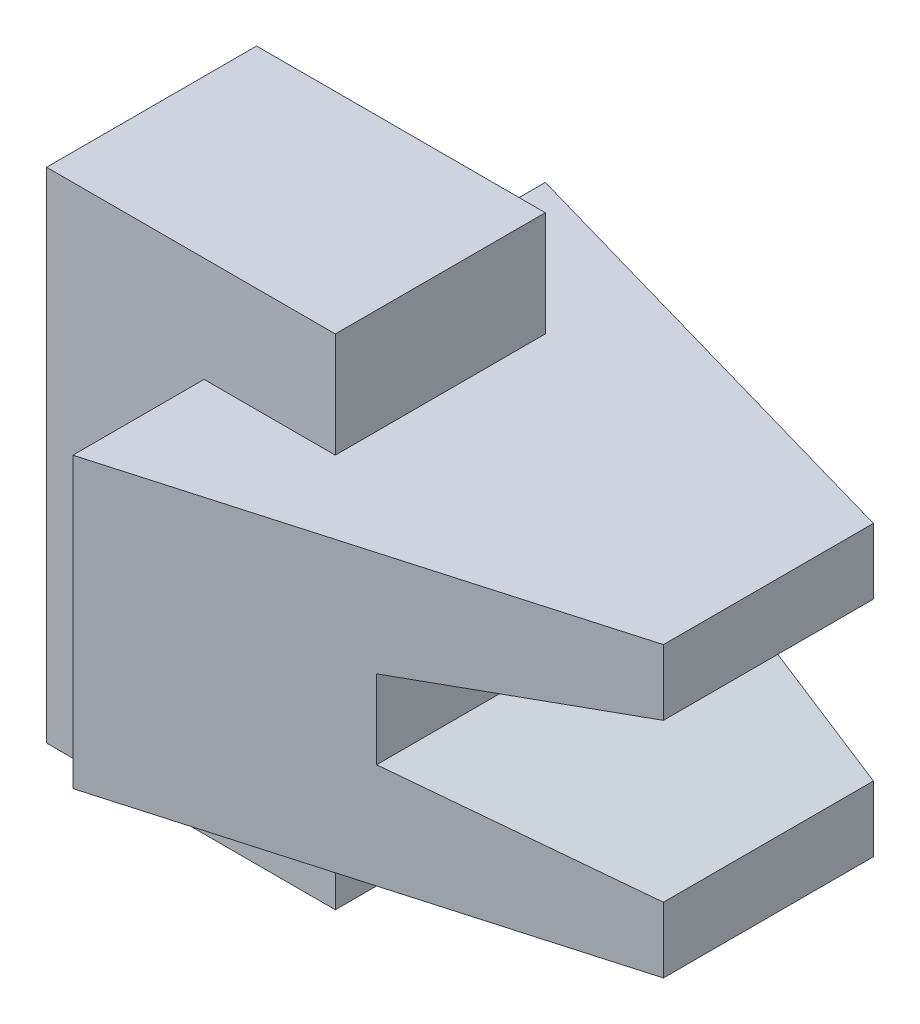
ISO-10303-21;
HEADER;
FILE_DESCRIPTION(('STEP AP214'),'2;1');
FILE_NAME('part.step','',(''),(''),'','','');
FILE_SCHEMA(('AUTOMOTIVE_DESIGN { 1 0 10303 214 1 1 1 1 }'));
ENDSEC;
DATA;
#1=APPLICATION_CONTEXT('core data for automotive mechanical design processes');
#2=APPLICATION_PROTOCOL_DEFINITION('international standard','automotive_design',2000,#1);
#3=PRODUCT_CONTEXT('',#1,'mechanical');
#4=PRODUCT('Part','Part','',(#3));
#5=PRODUCT_RELATED_PRODUCT_CATEGORY('part','',(#4));
#6=PRODUCT_DEFINITION_FORMATION('','',#4);
#7=PRODUCT_DEFINITION_CONTEXT('part definition',#1,'design');
#8=PRODUCT_DEFINITION('design','',#6,#7);
#9=PRODUCT_DEFINITION_SHAPE('','',#8);
#10=(LENGTH_UNIT() NAMED_UNIT(*) SI_UNIT(.MILLI.,.METRE.));
#11=(NAMED_UNIT(*) PLANE_ANGLE_UNIT() SI_UNIT($,.RADIAN.));
#12=(NAMED_UNIT(*) SI_UNIT($,.STERADIAN.) SOLID_ANGLE_UNIT());
#13=UNCERTAINTY_MEASURE_WITH_UNIT(LENGTH_MEASURE(1.E-05),#10,'distance_accuracy_value','');
#14=(GEOMETRIC_REPRESENTATION_CONTEXT(3) GLOBAL_UNCERTAINTY_ASSIGNED_CONTEXT((#13)) GLOBAL_UNIT_ASSIGNED_CONTEXT((#10,
#11,#12)) REPRESENTATION_CONTEXT('',''));
#15=CARTESIAN_POINT('',(0.,0.,0.));
#16=DIRECTION('',(0.,0.,1.));
#17=DIRECTION('',(1.,0.,0.));
#18=AXIS2_PLACEMENT_3D('',#15,#16,#17);
#19=CARTESIAN_POINT('',(-27.7219251336898,22.,-18.));
#20=DIRECTION('',(1.,0.,0.));
#21=DIRECTION('',(0.,0.,-1.));
#22=AXIS2_PLACEMENT_3D('',#19,#20,#21);
#23=PLANE('',#22);
#24=DIRECTION('',(0.,1.,0.));
#25=VECTOR('',#24,1.);
#26=CARTESIAN_POINT('',(-27.7219251336898,22.,8.));
#27=LINE('',#26,#25);
#28=CARTESIAN_POINT('',(-27.7219251336898,0.,8.));
#29=VERTEX_POINT('',#28);
#30=CARTESIAN_POINT('',(-27.7219251336898,22.,8.));
#31=VERTEX_POINT('',#30);
#32=EDGE_CURVE('E179',#29,#31,#27,.T.);
#33=ORIENTED_EDGE('',*,*,#32,.F.);
#34=DIRECTION('',(0.,0.,1.));
#35=VECTOR('',#34,1.);
#36=CARTESIAN_POINT('',(-27.7219251336898,0.,-18.));
#37=LINE('',#36,#35);
#38=CARTESIAN_POINT('',(-27.7219251336898,0.,18.));
#39=VERTEX_POINT('',#38);
#40=EDGE_CURVE('E246',#29,#39,#37,.T.);
#41=ORIENTED_EDGE('',*,*,#40,.T.);
#42=DIRECTION('',(0.,-1.,0.));
#43=VECTOR('',#42,1.);
#44=CARTESIAN_POINT('',(-27.7219251336898,22.,18.));
#45=LINE('',#44,#43);
#46=CARTESIAN_POINT('',(-27.7219251336898,22.,18.));
#47=VERTEX_POINT('',#46);
#48=EDGE_CURVE('E262',#47,#39,#45,.T.);
#49=ORIENTED_EDGE('',*,*,#48,.F.);
#50=DIRECTION('',(0.,0.,1.));
#51=VECTOR('',#50,1.);
#52=CARTESIAN_POINT('',(-27.7219251336898,22.,-18.));
#53=LINE('',#52,#51);
#54=EDGE_CURVE('E235',#31,#47,#53,.T.);
#55=ORIENTED_EDGE('',*,*,#54,.F.);
#56=EDGE_LOOP('',(#33,#41,#49,#55));
#57=FACE_BOUND('',#56,.T.);
#58=ADVANCED_FACE('F33',(#57),#23,.F.);
#59=CARTESIAN_POINT('',(7.27807486631017,22.,8.));
#60=DIRECTION('',(-1.,0.,0.));
#61=DIRECTION('',(0.,0.,1.));
#62=AXIS2_PLACEMENT_3D('',#59,#60,#61);
#63=PLANE('',#62);
#64=DIRECTION('',(0.,-1.,0.));
#65=VECTOR('',#64,1.);
#66=CARTESIAN_POINT('',(7.27807486631017,22.,8.));
#67=LINE('',#66,#65);
#68=CARTESIAN_POINT('',(7.27807486631017,22.,8.));
#69=VERTEX_POINT('',#68);
#70=CARTESIAN_POINT('',(7.27807486631016,17.,8.));
#71=VERTEX_POINT('',#70);
#72=EDGE_CURVE('E259',#69,#71,#67,.T.);
#73=ORIENTED_EDGE('',*,*,#72,.T.);
#74=DIRECTION('',(0.,0.,-1.));
#75=VECTOR('',#74,1.);
#76=CARTESIAN_POINT('',(7.27807486631017,17.,8.));
#77=LINE('',#76,#75);
#78=CARTESIAN_POINT('',(7.27807486631016,17.,-8.));
#79=VERTEX_POINT('',#78);
#80=EDGE_CURVE('E41',#71,#79,#77,.T.);
#81=ORIENTED_EDGE('',*,*,#80,.T.);
#82=DIRECTION('',(0.,-1.,0.));
#83=VECTOR('',#82,1.);
#84=CARTESIAN_POINT('',(7.27807486631017,22.,-8.));
#85=LINE('',#84,#83);
#86=CARTESIAN_POINT('',(7.27807486631017,22.,-8.));
#87=VERTEX_POINT('',#86);
#88=EDGE_CURVE('E255',#87,#79,#85,.T.);
#89=ORIENTED_EDGE('',*,*,#88,.F.);
#90=DIRECTION('',(0.,0.,-1.));
#91=VECTOR('',#90,1.);
#92=CARTESIAN_POINT('',(7.27807486631017,22.,8.));
#93=LINE('',#92,#91);
#94=EDGE_CURVE('E241',#69,#87,#93,.T.);
#95=ORIENTED_EDGE('',*,*,#94,.F.);
#96=EDGE_LOOP('',(#73,#81,#89,#95));
#97=FACE_BOUND('',#96,.T.);
#98=ADVANCED_FACE('F273',(#97),#63,.F.);
#99=CARTESIAN_POINT('',(7.27807486631017,22.,-8.));
#100=DIRECTION('',(-0.274721127897378,0.,0.961523947640823));
#101=DIRECTION('',(0.961523947640823,0.,0.274721127897378));
#102=AXIS2_PLACEMENT_3D('',#99,#100,#101);
#103=PLANE('',#102);
#104=ORIENTED_EDGE('',*,*,#88,.T.);
#105=DIRECTION('',(-0.947973972008479,-0.167289524472085,-0.270849706288137));
#106=VECTOR('',#105,1.);
#107=CARTESIAN_POINT('',(8.07100544125623,17.1399289249905,-7.77344840715827));
#108=LINE('',#107,#106);
#109=CARTESIAN_POINT('',(-9.72192513368984,14.,-12.8571428571429));
#110=VERTEX_POINT('',#109);
#111=EDGE_CURVE('E225',#79,#110,#108,.T.);
#112=ORIENTED_EDGE('',*,*,#111,.T.);
#113=DIRECTION('',(0.,-1.,0.));
#114=VECTOR('',#113,1.);
#115=CARTESIAN_POINT('',(-9.72192513368984,22.,-12.8571428571429));
#116=LINE('',#115,#114);
#117=CARTESIAN_POINT('',(-9.72192513368984,8.,-12.8571428571429));
#118=VERTEX_POINT('',#117);
#119=EDGE_CURVE('E228',#110,#118,#116,.T.);
#120=ORIENTED_EDGE('',*,*,#119,.T.);
#121=DIRECTION('',(0.947973972008479,-0.167289524472085,0.270849706288137));
#122=VECTOR('',#121,1.);
#123=CARTESIAN_POINT('',(4.58211091149357,5.47575834496763,-8.77027541566189));
#124=LINE('',#123,#122);
#125=CARTESIAN_POINT('',(7.27807486631017,5.,-8.));
#126=VERTEX_POINT('',#125);
#127=EDGE_CURVE('E219',#118,#126,#124,.T.);
#128=ORIENTED_EDGE('',*,*,#127,.T.);
#129=CARTESIAN_POINT('',(7.27807486631017,0.,-8.));
#130=VERTEX_POINT('',#129);
#131=EDGE_CURVE('E243',#126,#130,#85,.T.);
#132=ORIENTED_EDGE('',*,*,#131,.T.);
#133=DIRECTION('',(-0.961523947640823,0.,-0.274721127897378));
#134=VECTOR('',#133,1.);
#135=CARTESIAN_POINT('',(7.27807486631017,0.,-8.));
#136=LINE('',#135,#134);
#137=CARTESIAN_POINT('',(-27.7219251336898,0.,-18.));
#138=VERTEX_POINT('',#137);
#139=EDGE_CURVE('E231',#130,#138,#136,.T.);
#140=ORIENTED_EDGE('',*,*,#139,.T.);
#141=DIRECTION('',(0.,-1.,0.));
#142=VECTOR('',#141,1.);
#143=CARTESIAN_POINT('',(-27.7219251336898,22.,-18.));
#144=LINE('',#143,#142);
#145=CARTESIAN_POINT('',(-27.7219251336898,22.,-18.));
#146=VERTEX_POINT('',#145);
#147=EDGE_CURVE('E265',#146,#138,#144,.T.);
#148=ORIENTED_EDGE('',*,*,#147,.F.);
#149=DIRECTION('',(-0.961523947640823,0.,-0.274721127897378));
#150=VECTOR('',#149,1.);
#151=CARTESIAN_POINT('',(7.27807486631017,22.,-8.));
#152=LINE('',#151,#150);
#153=EDGE_CURVE('E232',#87,#146,#152,.T.);
#154=ORIENTED_EDGE('',*,*,#153,.F.);
#155=EDGE_LOOP('',(#104,#112,#120,#128,#132,#140,#148,#154));
#156=FACE_BOUND('',#155,.T.);
#157=ADVANCED_FACE('F35',(#156),#103,.F.);
#158=CARTESIAN_POINT('',(-27.7219251336898,0.,-8.));
#159=VERTEX_POINT('',#158);
#160=EDGE_CURVE('E247',#138,#159,#37,.T.);
#161=ORIENTED_EDGE('',*,*,#160,.T.);
#162=DIRECTION('',(0.,1.,0.));
#163=VECTOR('',#162,1.);
#164=CARTESIAN_POINT('',(-27.7219251336898,22.,-8.));
#165=LINE('',#164,#163);
#166=CARTESIAN_POINT('',(-27.7219251336898,22.,-8.));
#167=VERTEX_POINT('',#166);
#168=EDGE_CURVE('E196',#159,#167,#165,.T.);
#169=ORIENTED_EDGE('',*,*,#168,.T.);
#170=EDGE_CURVE('E237',#146,#167,#53,.T.);
#171=ORIENTED_EDGE('',*,*,#170,.F.);
#172=ORIENTED_EDGE('',*,*,#147,.T.);
#173=EDGE_LOOP('',(#161,#169,#171,#172));
#174=FACE_BOUND('',#173,.T.);
#175=ADVANCED_FACE('F304',(#174),#23,.F.);
#176=CARTESIAN_POINT('',(-27.7219251336898,22.,18.));
#177=DIRECTION('',(-0.274721127897378,0.,-0.961523947640823));
#178=DIRECTION('',(-0.961523947640823,0.,0.274721127897378));
#179=AXIS2_PLACEMENT_3D('',#176,#177,#178);
#180=PLANE('',#179);
#181=DIRECTION('',(0.,1.,0.));
#182=VECTOR('',#181,1.);
#183=CARTESIAN_POINT('',(-9.72192513368984,22.,12.8571428571429));
#184=LINE('',#183,#182);
#185=CARTESIAN_POINT('',(-9.72192513368984,8.,12.8571428571429));
#186=VERTEX_POINT('',#185);
#187=CARTESIAN_POINT('',(-9.72192513368984,14.,12.8571428571429));
#188=VERTEX_POINT('',#187);
#189=EDGE_CURVE('E11',#186,#188,#184,.T.);
#190=ORIENTED_EDGE('',*,*,#189,.T.);
#191=DIRECTION('',(0.947973972008479,0.167289524472085,-0.270849706288137));
#192=VECTOR('',#191,1.);
#193=CARTESIAN_POINT('',(-25.9494920838104,11.1363117146846,17.4935905571773));
#194=LINE('',#193,#192);
#195=EDGE_CURVE('E222',#188,#71,#194,.T.);
#196=ORIENTED_EDGE('',*,*,#195,.T.);
#197=ORIENTED_EDGE('',*,*,#72,.F.);
#198=DIRECTION('',(0.961523947640823,0.,-0.274721127897378));
#199=VECTOR('',#198,1.);
#200=CARTESIAN_POINT('',(-27.7219251336898,22.,18.));
#201=LINE('',#200,#199);
#202=EDGE_CURVE('E239',#47,#69,#201,.T.);
#203=ORIENTED_EDGE('',*,*,#202,.F.);
#204=ORIENTED_EDGE('',*,*,#48,.T.);
#205=DIRECTION('',(0.961523947640823,0.,-0.274721127897378));
#206=VECTOR('',#205,1.);
#207=CARTESIAN_POINT('',(-27.7219251336898,0.,18.));
#208=LINE('',#207,#206);
#209=CARTESIAN_POINT('',(7.27807486631017,0.,8.));
#210=VERTEX_POINT('',#209);
#211=EDGE_CURVE('E250',#39,#210,#208,.T.);
#212=ORIENTED_EDGE('',*,*,#211,.T.);
#213=CARTESIAN_POINT('',(7.27807486631017,4.99999999999999,8.));
#214=VERTEX_POINT('',#213);
#215=EDGE_CURVE('E258',#214,#210,#67,.T.);
#216=ORIENTED_EDGE('',*,*,#215,.F.);
#217=DIRECTION('',(-0.947973972008479,0.167289524472085,0.270849706288137));
#218=VECTOR('',#217,1.);
#219=CARTESIAN_POINT('',(-29.4383866135731,11.4793755552735,18.4904175656809));
#220=LINE('',#219,#218);
#221=EDGE_CURVE('E214',#214,#186,#220,.T.);
#222=ORIENTED_EDGE('',*,*,#221,.T.);
#223=EDGE_LOOP('',(#190,#196,#197,#203,#204,#212,#216,#222));
#224=FACE_BOUND('',#223,.T.);
#225=ADVANCED_FACE('F285',(#224),#180,.F.);
#226=ORIENTED_EDGE('',*,*,#131,.F.);
#227=DIRECTION('',(0.,0.,1.));
#228=VECTOR('',#227,1.);
#229=CARTESIAN_POINT('',(7.27807486631017,4.99999999999999,8.));
#230=LINE('',#229,#228);
#231=EDGE_CURVE('E268',#126,#214,#230,.T.);
#232=ORIENTED_EDGE('',*,*,#231,.T.);
#233=ORIENTED_EDGE('',*,*,#215,.T.);
#234=DIRECTION('',(0.,0.,-1.));
#235=VECTOR('',#234,1.);
#236=CARTESIAN_POINT('',(7.27807486631017,0.,8.));
#237=LINE('',#236,#235);
#238=EDGE_CURVE('E236',#210,#130,#237,.T.);
#239=ORIENTED_EDGE('',*,*,#238,.T.);
#240=EDGE_LOOP('',(#226,#232,#233,#239));
#241=FACE_BOUND('',#240,.T.);
#242=ADVANCED_FACE('F294',(#241),#63,.F.);
#243=CARTESIAN_POINT('',(0.,22.,0.));
#244=DIRECTION('',(0.,1.,0.));
#245=DIRECTION('',(0.,0.,1.));
#246=AXIS2_PLACEMENT_3D('',#243,#244,#245);
#247=PLANE('',#246);
#248=DIRECTION('',(1.,0.,0.));
#249=VECTOR('',#248,1.);
#250=CARTESIAN_POINT('',(-17.7219251336898,22.,-8.));
#251=LINE('',#250,#249);
#252=CARTESIAN_POINT('',(-17.7219251336898,22.,-8.));
#253=VERTEX_POINT('',#252);
#254=EDGE_CURVE('E48',#167,#253,#251,.T.);
#255=ORIENTED_EDGE('',*,*,#254,.T.);
#256=DIRECTION('',(0.,0.,1.));
#257=VECTOR('',#256,1.);
#258=CARTESIAN_POINT('',(-17.7219251336898,22.,-8.));
#259=LINE('',#258,#257);
#260=CARTESIAN_POINT('',(-17.7219251336898,22.,8.));
#261=VERTEX_POINT('',#260);
#262=EDGE_CURVE('E52',#253,#261,#259,.T.);
#263=ORIENTED_EDGE('',*,*,#262,.T.);
#264=DIRECTION('',(1.,0.,0.));
#265=VECTOR('',#264,1.);
#266=CARTESIAN_POINT('',(-17.7219251336898,22.,8.));
#267=LINE('',#266,#265);
#268=EDGE_CURVE('E182',#31,#261,#267,.T.);
#269=ORIENTED_EDGE('',*,*,#268,.F.);
#270=ORIENTED_EDGE('',*,*,#54,.T.);
#271=ORIENTED_EDGE('',*,*,#202,.T.);
#272=ORIENTED_EDGE('',*,*,#94,.T.);
#273=ORIENTED_EDGE('',*,*,#153,.T.);
#274=ORIENTED_EDGE('',*,*,#170,.T.);
#275=EDGE_LOOP('',(#255,#263,#269,#270,#271,#272,#273,#274));
#276=FACE_BOUND('',#275,.T.);
#277=ADVANCED_FACE('F280',(#276),#247,.T.);
#278=CARTESIAN_POINT('',(0.,0.,0.));
#279=DIRECTION('',(0.,1.,0.));
#280=DIRECTION('',(0.,0.,1.));
#281=AXIS2_PLACEMENT_3D('',#278,#279,#280);
#282=PLANE('',#281);
#283=DIRECTION('',(0.,0.,1.));
#284=VECTOR('',#283,1.);
#285=CARTESIAN_POINT('',(-17.7219251336898,0.,-8.));
#286=LINE('',#285,#284);
#287=CARTESIAN_POINT('',(-17.7219251336898,0.,-8.));
#288=VERTEX_POINT('',#287);
#289=CARTESIAN_POINT('',(-17.7219251336898,0.,8.));
#290=VERTEX_POINT('',#289);
#291=EDGE_CURVE('E205',#288,#290,#286,.T.);
#292=ORIENTED_EDGE('',*,*,#291,.F.);
#293=DIRECTION('',(-1.,0.,0.));
#294=VECTOR('',#293,1.);
#295=CARTESIAN_POINT('',(-27.7219251336898,0.,-8.));
#296=LINE('',#295,#294);
#297=EDGE_CURVE('E194',#288,#159,#296,.T.);
#298=ORIENTED_EDGE('',*,*,#297,.T.);
#299=ORIENTED_EDGE('',*,*,#160,.F.);
#300=ORIENTED_EDGE('',*,*,#139,.F.);
#301=ORIENTED_EDGE('',*,*,#238,.F.);
#302=ORIENTED_EDGE('',*,*,#211,.F.);
#303=ORIENTED_EDGE('',*,*,#40,.F.);
#304=DIRECTION('',(-1.,0.,0.));
#305=VECTOR('',#304,1.);
#306=CARTESIAN_POINT('',(-27.7219251336898,0.,8.));
#307=LINE('',#306,#305);
#308=EDGE_CURVE('E176',#290,#29,#307,.T.);
#309=ORIENTED_EDGE('',*,*,#308,.F.);
#310=EDGE_LOOP('',(#292,#298,#299,#300,#301,#302,#303,#309));
#311=FACE_BOUND('',#310,.T.);
#312=ADVANCED_FACE('F300',(#311),#282,.F.);
#313=CARTESIAN_POINT('',(-9.72192513368984,14.,-18.));
#314=DIRECTION('',(-1.,0.,0.));
#315=DIRECTION('',(0.,0.,1.));
#316=AXIS2_PLACEMENT_3D('',#313,#314,#315);
#317=PLANE('',#316);
#318=DIRECTION('',(0.,0.,1.));
#319=VECTOR('',#318,1.);
#320=CARTESIAN_POINT('',(-9.72192513368984,14.,-18.));
#321=LINE('',#320,#319);
#322=EDGE_CURVE('E203',#110,#188,#321,.T.);
#323=ORIENTED_EDGE('',*,*,#322,.T.);
#324=ORIENTED_EDGE('',*,*,#189,.F.);
#325=DIRECTION('',(0.,0.,1.));
#326=VECTOR('',#325,1.);
#327=CARTESIAN_POINT('',(-9.72192513368984,8.,-18.));
#328=LINE('',#327,#326);
#329=EDGE_CURVE('E211',#118,#186,#328,.T.);
#330=ORIENTED_EDGE('',*,*,#329,.F.);
#331=ORIENTED_EDGE('',*,*,#119,.F.);
#332=EDGE_LOOP('',(#323,#324,#330,#331));
#333=FACE_BOUND('',#332,.T.);
#334=ADVANCED_FACE('F289',(#333),#317,.F.);
#335=CARTESIAN_POINT('',(-9.72192513368984,14.,-18.));
#336=DIRECTION('',(-0.173785333909048,0.984783558817937,0.));
#337=DIRECTION('',(-0.984783558817937,-0.173785333909048,0.));
#338=AXIS2_PLACEMENT_3D('',#335,#336,#337);
#339=PLANE('',#338);
#340=ORIENTED_EDGE('',*,*,#80,.F.);
#341=ORIENTED_EDGE('',*,*,#195,.F.);
#342=ORIENTED_EDGE('',*,*,#322,.F.);
#343=ORIENTED_EDGE('',*,*,#111,.F.);
#344=EDGE_LOOP('',(#340,#341,#342,#343));
#345=FACE_BOUND('',#344,.T.);
#346=ADVANCED_FACE('F287',(#345),#339,.F.);
#347=CARTESIAN_POINT('',(-9.72192513368984,8.,-18.));
#348=DIRECTION('',(-0.173785333909048,-0.984783558817937,0.));
#349=DIRECTION('',(0.984783558817937,-0.173785333909048,0.));
#350=AXIS2_PLACEMENT_3D('',#347,#348,#349);
#351=PLANE('',#350);
#352=ORIENTED_EDGE('',*,*,#329,.T.);
#353=ORIENTED_EDGE('',*,*,#221,.F.);
#354=ORIENTED_EDGE('',*,*,#231,.F.);
#355=ORIENTED_EDGE('',*,*,#127,.F.);
#356=EDGE_LOOP('',(#352,#353,#354,#355));
#357=FACE_BOUND('',#356,.T.);
#358=ADVANCED_FACE('F321',(#357),#351,.F.);
#359=CARTESIAN_POINT('',(-39.7219251336898,30.,-8.));
#360=DIRECTION('',(0.,1.,0.));
#361=DIRECTION('',(0.,0.,1.));
#362=AXIS2_PLACEMENT_3D('',#359,#360,#361);
#363=PLANE('',#362);
#364=DIRECTION('',(0.,0.,1.));
#365=VECTOR('',#364,1.);
#366=CARTESIAN_POINT('',(-39.7219251336898,30.,-8.));
#367=LINE('',#366,#365);
#368=CARTESIAN_POINT('',(-39.7219251336898,30.,-8.));
#369=VERTEX_POINT('',#368);
#370=CARTESIAN_POINT('',(-39.7219251336898,30.,8.));
#371=VERTEX_POINT('',#370);
#372=EDGE_CURVE('E145',#369,#371,#367,.T.);
#373=ORIENTED_EDGE('',*,*,#372,.T.);
#374=DIRECTION('',(-1.,0.,0.));
#375=VECTOR('',#374,1.);
#376=CARTESIAN_POINT('',(-39.7219251336898,30.,8.));
#377=LINE('',#376,#375);
#378=CARTESIAN_POINT('',(-17.7219251336898,30.,8.));
#379=VERTEX_POINT('',#378);
#380=EDGE_CURVE('E149',#379,#371,#377,.T.);
#381=ORIENTED_EDGE('',*,*,#380,.F.);
#382=DIRECTION('',(0.,0.,1.));
#383=VECTOR('',#382,1.);
#384=CARTESIAN_POINT('',(-17.7219251336898,30.,-8.));
#385=LINE('',#384,#383);
#386=CARTESIAN_POINT('',(-17.7219251336898,30.,-8.));
#387=VERTEX_POINT('',#386);
#388=EDGE_CURVE('E201',#387,#379,#385,.T.);
#389=ORIENTED_EDGE('',*,*,#388,.F.);
#390=DIRECTION('',(-1.,0.,0.));
#391=VECTOR('',#390,1.);
#392=CARTESIAN_POINT('',(-39.7219251336898,30.,-8.));
#393=LINE('',#392,#391);
#394=EDGE_CURVE('E151',#387,#369,#393,.T.);
#395=ORIENTED_EDGE('',*,*,#394,.T.);
#396=EDGE_LOOP('',(#373,#381,#389,#395));
#397=FACE_BOUND('',#396,.T.);
#398=ADVANCED_FACE('F147',(#397),#363,.T.);
#399=CARTESIAN_POINT('',(-17.7219251336898,30.,-8.));
#400=DIRECTION('',(1.,0.,0.));
#401=DIRECTION('',(0.,0.,-1.));
#402=AXIS2_PLACEMENT_3D('',#399,#400,#401);
#403=PLANE('',#402);
#404=ORIENTED_EDGE('',*,*,#388,.T.);
#405=DIRECTION('',(0.,1.,0.));
#406=VECTOR('',#405,1.);
#407=CARTESIAN_POINT('',(-17.7219251336898,30.,8.));
#408=LINE('',#407,#406);
#409=EDGE_CURVE('E169',#261,#379,#408,.T.);
#410=ORIENTED_EDGE('',*,*,#409,.F.);
#411=ORIENTED_EDGE('',*,*,#262,.F.);
#412=DIRECTION('',(0.,1.,0.));
#413=VECTOR('',#412,1.);
#414=CARTESIAN_POINT('',(-17.7219251336898,30.,-8.));
#415=LINE('',#414,#413);
#416=EDGE_CURVE('E156',#253,#387,#415,.T.);
#417=ORIENTED_EDGE('',*,*,#416,.T.);
#418=EDGE_LOOP('',(#404,#410,#411,#417));
#419=FACE_BOUND('',#418,.T.);
#420=ADVANCED_FACE('F310',(#419),#403,.T.);
#421=CARTESIAN_POINT('',(-17.7219251336898,0.,-8.));
#422=DIRECTION('',(1.,0.,0.));
#423=DIRECTION('',(0.,1.,0.));
#424=AXIS2_PLACEMENT_3D('',#421,#422,#423);
#425=PLANE('',#424);
#426=ORIENTED_EDGE('',*,*,#291,.T.);
#427=DIRECTION('',(0.,1.,0.));
#428=VECTOR('',#427,1.);
#429=CARTESIAN_POINT('',(-17.7219251336898,0.,8.));
#430=LINE('',#429,#428);
#431=CARTESIAN_POINT('',(-17.7219251336898,-8.,8.));
#432=VERTEX_POINT('',#431);
#433=EDGE_CURVE('E173',#432,#290,#430,.T.);
#434=ORIENTED_EDGE('',*,*,#433,.F.);
#435=DIRECTION('',(0.,0.,1.));
#436=VECTOR('',#435,1.);
#437=CARTESIAN_POINT('',(-17.7219251336898,-8.,-8.));
#438=LINE('',#437,#436);
#439=CARTESIAN_POINT('',(-17.7219251336898,-8.,-8.));
#440=VERTEX_POINT('',#439);
#441=EDGE_CURVE('E208',#440,#432,#438,.T.);
#442=ORIENTED_EDGE('',*,*,#441,.F.);
#443=DIRECTION('',(0.,1.,0.));
#444=VECTOR('',#443,1.);
#445=CARTESIAN_POINT('',(-17.7219251336898,0.,-8.));
#446=LINE('',#445,#444);
#447=EDGE_CURVE('E191',#440,#288,#446,.T.);
#448=ORIENTED_EDGE('',*,*,#447,.T.);
#449=EDGE_LOOP('',(#426,#434,#442,#448));
#450=FACE_BOUND('',#449,.T.);
#451=ADVANCED_FACE('F312',(#450),#425,.T.);
#452=CARTESIAN_POINT('',(-17.7219251336898,-8.,-8.));
#453=DIRECTION('',(0.,-1.,0.));
#454=DIRECTION('',(0.,0.,-1.));
#455=AXIS2_PLACEMENT_3D('',#452,#453,#454);
#456=PLANE('',#455);
#457=ORIENTED_EDGE('',*,*,#441,.T.);
#458=DIRECTION('',(1.,0.,0.));
#459=VECTOR('',#458,1.);
#460=CARTESIAN_POINT('',(-17.7219251336898,-8.,8.));
#461=LINE('',#460,#459);
#462=CARTESIAN_POINT('',(-39.7219251336898,-8.,8.));
#463=VERTEX_POINT('',#462);
#464=EDGE_CURVE('E164',#463,#432,#461,.T.);
#465=ORIENTED_EDGE('',*,*,#464,.F.);
#466=DIRECTION('',(0.,0.,1.));
#467=VECTOR('',#466,1.);
#468=CARTESIAN_POINT('',(-39.7219251336898,-8.,-8.));
#469=LINE('',#468,#467);
#470=CARTESIAN_POINT('',(-39.7219251336898,-8.,-8.));
#471=VERTEX_POINT('',#470);
#472=EDGE_CURVE('E155',#471,#463,#469,.T.);
#473=ORIENTED_EDGE('',*,*,#472,.F.);
#474=DIRECTION('',(1.,0.,0.));
#475=VECTOR('',#474,1.);
#476=CARTESIAN_POINT('',(-17.7219251336898,-8.,-8.));
#477=LINE('',#476,#475);
#478=EDGE_CURVE('E188',#471,#440,#477,.T.);
#479=ORIENTED_EDGE('',*,*,#478,.T.);
#480=EDGE_LOOP('',(#457,#465,#473,#479));
#481=FACE_BOUND('',#480,.T.);
#482=ADVANCED_FACE('F318',(#481),#456,.T.);
#483=CARTESIAN_POINT('',(-39.7219251336898,30.,-8.));
#484=DIRECTION('',(-1.,0.,0.));
#485=DIRECTION('',(0.,0.,1.));
#486=AXIS2_PLACEMENT_3D('',#483,#484,#485);
#487=PLANE('',#486);
#488=ORIENTED_EDGE('',*,*,#472,.T.);
#489=DIRECTION('',(0.,-1.,0.));
#490=VECTOR('',#489,1.);
#491=CARTESIAN_POINT('',(-39.7219251336898,30.,8.));
#492=LINE('',#491,#490);
#493=EDGE_CURVE('E159',#371,#463,#492,.T.);
#494=ORIENTED_EDGE('',*,*,#493,.F.);
#495=ORIENTED_EDGE('',*,*,#372,.F.);
#496=DIRECTION('',(0.,-1.,0.));
#497=VECTOR('',#496,1.);
#498=CARTESIAN_POINT('',(-39.7219251336898,30.,-8.));
#499=LINE('',#498,#497);
#500=EDGE_CURVE('E186',#369,#471,#499,.T.);
#501=ORIENTED_EDGE('',*,*,#500,.T.);
#502=EDGE_LOOP('',(#488,#494,#495,#501));
#503=FACE_BOUND('',#502,.T.);
#504=ADVANCED_FACE('F160',(#503),#487,.T.);
#505=CARTESIAN_POINT('',(0.,0.,-8.));
#506=DIRECTION('',(0.,0.,-1.));
#507=DIRECTION('',(-1.,0.,0.));
#508=AXIS2_PLACEMENT_3D('',#505,#506,#507);
#509=PLANE('',#508);
#510=ORIENTED_EDGE('',*,*,#394,.F.);
#511=ORIENTED_EDGE('',*,*,#416,.F.);
#512=ORIENTED_EDGE('',*,*,#254,.F.);
#513=ORIENTED_EDGE('',*,*,#168,.F.);
#514=ORIENTED_EDGE('',*,*,#297,.F.);
#515=ORIENTED_EDGE('',*,*,#447,.F.);
#516=ORIENTED_EDGE('',*,*,#478,.F.);
#517=ORIENTED_EDGE('',*,*,#500,.F.);
#518=EDGE_LOOP('',(#510,#511,#512,#513,#514,#515,#516,#517));
#519=FACE_BOUND('',#518,.T.);
#520=ADVANCED_FACE('F306',(#519),#509,.T.);
#521=CARTESIAN_POINT('',(0.,0.,8.));
#522=DIRECTION('',(0.,0.,-1.));
#523=DIRECTION('',(-1.,0.,0.));
#524=AXIS2_PLACEMENT_3D('',#521,#522,#523);
#525=PLANE('',#524);
#526=ORIENTED_EDGE('',*,*,#380,.T.);
#527=ORIENTED_EDGE('',*,*,#493,.T.);
#528=ORIENTED_EDGE('',*,*,#464,.T.);
#529=ORIENTED_EDGE('',*,*,#433,.T.);
#530=ORIENTED_EDGE('',*,*,#308,.T.);
#531=ORIENTED_EDGE('',*,*,#32,.T.);
#532=ORIENTED_EDGE('',*,*,#268,.T.);
#533=ORIENTED_EDGE('',*,*,#409,.T.);
#534=EDGE_LOOP('',(#526,#527,#528,#529,#530,#531,#532,#533));
#535=FACE_BOUND('',#534,.T.);
#536=ADVANCED_FACE('F167',(#535),#525,.F.);
#537=CLOSED_SHELL('',(#58,#98,#157,#175,#225,#242,#277,#312,#334,#346,#358,#398,#420,#451,#482,
#504,#520,#536));
#538=MANIFOLD_SOLID_BREP('B2',#537);
#539=ADVANCED_BREP_SHAPE_REPRESENTATION('',(#18,#538),#14);
#540=SHAPE_DEFINITION_REPRESENTATION(#9,#539);
ENDSEC;
END-ISO-10303-21;
